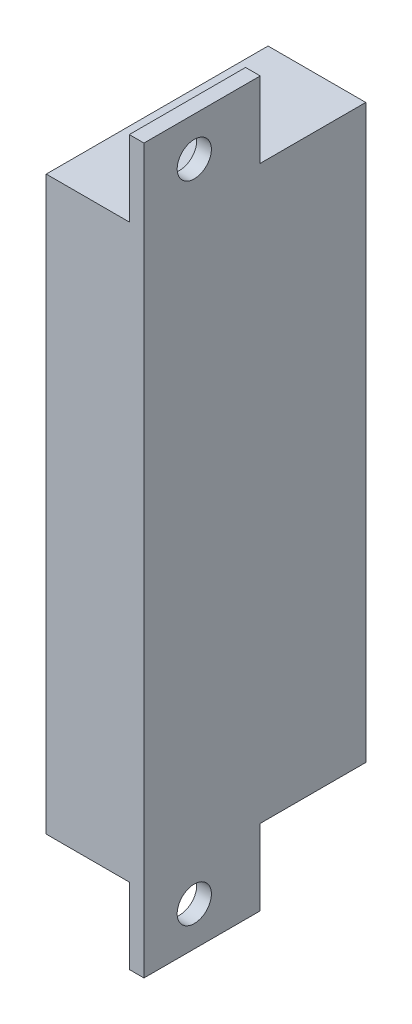
ISO-10303-21;
HEADER;
FILE_DESCRIPTION(('STEP AP214'),'2;1');
FILE_NAME('part.step','',(''),(''),'','','');
FILE_SCHEMA(('AUTOMOTIVE_DESIGN { 1 0 10303 214 1 1 1 1 }'));
ENDSEC;
DATA;
#1=APPLICATION_CONTEXT('core data for automotive mechanical design processes');
#2=APPLICATION_PROTOCOL_DEFINITION('international standard','automotive_design',2000,#1);
#3=PRODUCT_CONTEXT('',#1,'mechanical');
#4=PRODUCT('Part','Part','',(#3));
#5=PRODUCT_RELATED_PRODUCT_CATEGORY('part','',(#4));
#6=PRODUCT_DEFINITION_FORMATION('','',#4);
#7=PRODUCT_DEFINITION_CONTEXT('part definition',#1,'design');
#8=PRODUCT_DEFINITION('design','',#6,#7);
#9=PRODUCT_DEFINITION_SHAPE('','',#8);
#10=(LENGTH_UNIT() NAMED_UNIT(*) SI_UNIT(.MILLI.,.METRE.));
#11=(NAMED_UNIT(*) PLANE_ANGLE_UNIT() SI_UNIT($,.RADIAN.));
#12=(NAMED_UNIT(*) SI_UNIT($,.STERADIAN.) SOLID_ANGLE_UNIT());
#13=UNCERTAINTY_MEASURE_WITH_UNIT(LENGTH_MEASURE(1.E-05),#10,'distance_accuracy_value','');
#14=(GEOMETRIC_REPRESENTATION_CONTEXT(3) GLOBAL_UNCERTAINTY_ASSIGNED_CONTEXT((#13)) GLOBAL_UNIT_ASSIGNED_CONTEXT((#10,
#11,#12)) REPRESENTATION_CONTEXT('',''));
#15=CARTESIAN_POINT('',(0.,0.,0.));
#16=DIRECTION('',(0.,0.,1.));
#17=DIRECTION('',(1.,0.,0.));
#18=AXIS2_PLACEMENT_3D('',#15,#16,#17);
#19=CARTESIAN_POINT('',(145.,-102.25,46.35));
#20=DIRECTION('',(1.,0.,0.));
#21=DIRECTION('',(0.,0.,-1.));
#22=AXIS2_PLACEMENT_3D('',#19,#20,#21);
#23=PLANE('',#22);
#24=DIRECTION('',(0.,-1.,0.));
#25=VECTOR('',#24,1.);
#26=CARTESIAN_POINT('',(145.,-102.25,23.65));
#27=LINE('',#26,#25);
#28=CARTESIAN_POINT('',(145.,-43.75,23.65));
#29=VERTEX_POINT('',#28);
#30=CARTESIAN_POINT('',(145.,-102.25,23.65));
#31=VERTEX_POINT('',#30);
#32=EDGE_CURVE('E146',#29,#31,#27,.T.);
#33=ORIENTED_EDGE('',*,*,#32,.T.);
#34=DIRECTION('',(0.,0.,-1.));
#35=VECTOR('',#34,1.);
#36=CARTESIAN_POINT('',(145.,-102.25,46.35));
#37=LINE('',#36,#35);
#38=CARTESIAN_POINT('',(145.,-102.25,46.35));
#39=VERTEX_POINT('',#38);
#40=EDGE_CURVE('E11',#39,#31,#37,.T.);
#41=ORIENTED_EDGE('',*,*,#40,.F.);
#42=DIRECTION('',(0.,-1.,0.));
#43=VECTOR('',#42,1.);
#44=CARTESIAN_POINT('',(145.,-102.25,46.35));
#45=LINE('',#44,#43);
#46=CARTESIAN_POINT('',(145.,-43.75,46.35));
#47=VERTEX_POINT('',#46);
#48=EDGE_CURVE('E159',#47,#39,#45,.T.);
#49=ORIENTED_EDGE('',*,*,#48,.F.);
#50=DIRECTION('',(0.,0.,-1.));
#51=VECTOR('',#50,1.);
#52=CARTESIAN_POINT('',(145.,-43.75,46.35));
#53=LINE('',#52,#51);
#54=EDGE_CURVE('E138',#47,#29,#53,.T.);
#55=ORIENTED_EDGE('',*,*,#54,.T.);
#56=EDGE_LOOP('',(#33,#41,#49,#55));
#57=FACE_BOUND('',#56,.T.);
#58=ADVANCED_FACE('F41',(#57),#23,.F.);
#59=CARTESIAN_POINT('',(145.,-102.25,46.35));
#60=DIRECTION('',(0.,1.,0.));
#61=DIRECTION('',(0.,0.,1.));
#62=AXIS2_PLACEMENT_3D('',#59,#60,#61);
#63=PLANE('',#62);
#64=DIRECTION('',(0.,0.,-1.));
#65=VECTOR('',#64,1.);
#66=CARTESIAN_POINT('',(155.,-102.25,46.35));
#67=LINE('',#66,#65);
#68=CARTESIAN_POINT('',(155.,-102.25,34.45));
#69=VERTEX_POINT('',#68);
#70=CARTESIAN_POINT('',(155.,-102.25,23.65));
#71=VERTEX_POINT('',#70);
#72=EDGE_CURVE('E48',#69,#71,#67,.T.);
#73=ORIENTED_EDGE('',*,*,#72,.F.);
#74=DIRECTION('',(-1.,0.,0.));
#75=VECTOR('',#74,1.);
#76=CARTESIAN_POINT('',(153.5,-102.25,34.45));
#77=LINE('',#76,#75);
#78=CARTESIAN_POINT('',(153.5,-102.25,34.45));
#79=VERTEX_POINT('',#78);
#80=EDGE_CURVE('E187',#69,#79,#77,.T.);
#81=ORIENTED_EDGE('',*,*,#80,.T.);
#82=DIRECTION('',(0.,0.,-1.));
#83=VECTOR('',#82,1.);
#84=CARTESIAN_POINT('',(153.5,-102.25,46.35));
#85=LINE('',#84,#83);
#86=CARTESIAN_POINT('',(153.5,-102.25,46.35));
#87=VERTEX_POINT('',#86);
#88=EDGE_CURVE('E65',#87,#79,#85,.T.);
#89=ORIENTED_EDGE('',*,*,#88,.F.);
#90=DIRECTION('',(1.,0.,0.));
#91=VECTOR('',#90,1.);
#92=CARTESIAN_POINT('',(145.,-102.25,46.35));
#93=LINE('',#92,#91);
#94=EDGE_CURVE('E143',#39,#87,#93,.T.);
#95=ORIENTED_EDGE('',*,*,#94,.F.);
#96=ORIENTED_EDGE('',*,*,#40,.T.);
#97=DIRECTION('',(1.,0.,0.));
#98=VECTOR('',#97,1.);
#99=CARTESIAN_POINT('',(145.,-102.25,23.65));
#100=LINE('',#99,#98);
#101=EDGE_CURVE('E155',#31,#71,#100,.T.);
#102=ORIENTED_EDGE('',*,*,#101,.T.);
#103=EDGE_LOOP('',(#73,#81,#89,#95,#96,#102));
#104=FACE_BOUND('',#103,.T.);
#105=ADVANCED_FACE('F175',(#104),#63,.F.);
#106=CARTESIAN_POINT('',(155.,-102.25,46.35));
#107=DIRECTION('',(-1.,0.,0.));
#108=DIRECTION('',(0.,0.,1.));
#109=AXIS2_PLACEMENT_3D('',#106,#107,#108);
#110=PLANE('',#109);
#111=CARTESIAN_POINT('',(155.,-106.,41.2));
#112=DIRECTION('',(1.,0.,0.));
#113=DIRECTION('',(0.,0.,-1.));
#114=AXIS2_PLACEMENT_3D('',#111,#112,#113);
#115=CIRCLE('',#114,1.75);
#116=CARTESIAN_POINT('',(155.,-106.,39.45));
#117=VERTEX_POINT('',#116);
#118=EDGE_CURVE('E216',#117,#117,#115,.T.);
#119=ORIENTED_EDGE('',*,*,#118,.F.);
#120=EDGE_LOOP('',(#119));
#121=FACE_BOUND('',#120,.T.);
#122=CARTESIAN_POINT('',(155.,-40.,41.2));
#123=DIRECTION('',(1.,0.,0.));
#124=DIRECTION('',(0.,0.,-1.));
#125=AXIS2_PLACEMENT_3D('',#122,#123,#124);
#126=CIRCLE('',#125,1.75);
#127=CARTESIAN_POINT('',(155.,-40.,39.45));
#128=VERTEX_POINT('',#127);
#129=EDGE_CURVE('E215',#128,#128,#126,.T.);
#130=ORIENTED_EDGE('',*,*,#129,.F.);
#131=EDGE_LOOP('',(#130));
#132=FACE_BOUND('',#131,.T.);
#133=DIRECTION('',(0.,1.,0.));
#134=VECTOR('',#133,1.);
#135=CARTESIAN_POINT('',(155.,-102.25,23.65));
#136=LINE('',#135,#134);
#137=CARTESIAN_POINT('',(155.,-43.75,23.65));
#138=VERTEX_POINT('',#137);
#139=EDGE_CURVE('E156',#71,#138,#136,.T.);
#140=ORIENTED_EDGE('',*,*,#139,.T.);
#141=DIRECTION('',(0.,0.,-1.));
#142=VECTOR('',#141,1.);
#143=CARTESIAN_POINT('',(155.,-43.75,46.35));
#144=LINE('',#143,#142);
#145=CARTESIAN_POINT('',(155.,-43.75,34.45));
#146=VERTEX_POINT('',#145);
#147=EDGE_CURVE('E141',#146,#138,#144,.T.);
#148=ORIENTED_EDGE('',*,*,#147,.F.);
#149=DIRECTION('',(0.,1.,0.));
#150=VECTOR('',#149,1.);
#151=CARTESIAN_POINT('',(155.,-43.75,34.45));
#152=LINE('',#151,#150);
#153=CARTESIAN_POINT('',(155.,-36.,34.45));
#154=VERTEX_POINT('',#153);
#155=EDGE_CURVE('E202',#146,#154,#152,.T.);
#156=ORIENTED_EDGE('',*,*,#155,.T.);
#157=DIRECTION('',(0.,0.,-1.));
#158=VECTOR('',#157,1.);
#159=CARTESIAN_POINT('',(155.,-36.,46.35));
#160=LINE('',#159,#158);
#161=CARTESIAN_POINT('',(155.,-36.,46.35));
#162=VERTEX_POINT('',#161);
#163=EDGE_CURVE('E134',#162,#154,#160,.T.);
#164=ORIENTED_EDGE('',*,*,#163,.F.);
#165=DIRECTION('',(0.,1.,0.));
#166=VECTOR('',#165,1.);
#167=CARTESIAN_POINT('',(155.,-102.25,46.35));
#168=LINE('',#167,#166);
#169=CARTESIAN_POINT('',(155.,-110.,46.35));
#170=VERTEX_POINT('',#169);
#171=EDGE_CURVE('E142',#170,#162,#168,.T.);
#172=ORIENTED_EDGE('',*,*,#171,.F.);
#173=DIRECTION('',(0.,0.,-1.));
#174=VECTOR('',#173,1.);
#175=CARTESIAN_POINT('',(155.,-110.,46.35));
#176=LINE('',#175,#174);
#177=CARTESIAN_POINT('',(155.,-110.,34.45));
#178=VERTEX_POINT('',#177);
#179=EDGE_CURVE('E185',#170,#178,#176,.T.);
#180=ORIENTED_EDGE('',*,*,#179,.T.);
#181=DIRECTION('',(0.,1.,0.));
#182=VECTOR('',#181,1.);
#183=CARTESIAN_POINT('',(155.,-110.,34.45));
#184=LINE('',#183,#182);
#185=EDGE_CURVE('E167',#178,#69,#184,.T.);
#186=ORIENTED_EDGE('',*,*,#185,.T.);
#187=ORIENTED_EDGE('',*,*,#72,.T.);
#188=EDGE_LOOP('',(#140,#148,#156,#164,#172,#180,#186,#187));
#189=FACE_BOUND('',#188,.T.);
#190=ADVANCED_FACE('F165',(#121,#132,#189),#110,.F.);
#191=CARTESIAN_POINT('',(145.,-43.75,46.35));
#192=DIRECTION('',(0.,-1.,0.));
#193=DIRECTION('',(0.,0.,-1.));
#194=AXIS2_PLACEMENT_3D('',#191,#192,#193);
#195=PLANE('',#194);
#196=DIRECTION('',(0.,0.,-1.));
#197=VECTOR('',#196,1.);
#198=CARTESIAN_POINT('',(153.5,-43.75,46.35));
#199=LINE('',#198,#197);
#200=CARTESIAN_POINT('',(153.5,-43.75,46.35));
#201=VERTEX_POINT('',#200);
#202=CARTESIAN_POINT('',(153.5,-43.75,34.45));
#203=VERTEX_POINT('',#202);
#204=EDGE_CURVE('E128',#201,#203,#199,.T.);
#205=ORIENTED_EDGE('',*,*,#204,.T.);
#206=DIRECTION('',(1.,0.,0.));
#207=VECTOR('',#206,1.);
#208=CARTESIAN_POINT('',(153.5,-43.75,34.45));
#209=LINE('',#208,#207);
#210=EDGE_CURVE('E204',#203,#146,#209,.T.);
#211=ORIENTED_EDGE('',*,*,#210,.T.);
#212=ORIENTED_EDGE('',*,*,#147,.T.);
#213=DIRECTION('',(-1.,0.,0.));
#214=VECTOR('',#213,1.);
#215=CARTESIAN_POINT('',(145.,-43.75,23.65));
#216=LINE('',#215,#214);
#217=EDGE_CURVE('E158',#138,#29,#216,.T.);
#218=ORIENTED_EDGE('',*,*,#217,.T.);
#219=ORIENTED_EDGE('',*,*,#54,.F.);
#220=DIRECTION('',(-1.,0.,0.));
#221=VECTOR('',#220,1.);
#222=CARTESIAN_POINT('',(145.,-43.75,46.35));
#223=LINE('',#222,#221);
#224=EDGE_CURVE('E125',#201,#47,#223,.T.);
#225=ORIENTED_EDGE('',*,*,#224,.F.);
#226=EDGE_LOOP('',(#205,#211,#212,#218,#219,#225));
#227=FACE_BOUND('',#226,.T.);
#228=ADVANCED_FACE('F140',(#227),#195,.F.);
#229=CARTESIAN_POINT('',(0.,0.,46.35));
#230=DIRECTION('',(0.,0.,-1.));
#231=DIRECTION('',(-1.,0.,0.));
#232=AXIS2_PLACEMENT_3D('',#229,#230,#231);
#233=PLANE('',#232);
#234=ORIENTED_EDGE('',*,*,#48,.T.);
#235=ORIENTED_EDGE('',*,*,#94,.T.);
#236=DIRECTION('',(0.,-1.,0.));
#237=VECTOR('',#236,1.);
#238=CARTESIAN_POINT('',(153.5,-110.,46.35));
#239=LINE('',#238,#237);
#240=CARTESIAN_POINT('',(153.5,-110.,46.35));
#241=VERTEX_POINT('',#240);
#242=EDGE_CURVE('E189',#87,#241,#239,.T.);
#243=ORIENTED_EDGE('',*,*,#242,.T.);
#244=DIRECTION('',(1.,0.,0.));
#245=VECTOR('',#244,1.);
#246=CARTESIAN_POINT('',(153.5,-110.,46.35));
#247=LINE('',#246,#245);
#248=EDGE_CURVE('E184',#241,#170,#247,.T.);
#249=ORIENTED_EDGE('',*,*,#248,.T.);
#250=ORIENTED_EDGE('',*,*,#171,.T.);
#251=DIRECTION('',(-1.,0.,0.));
#252=VECTOR('',#251,1.);
#253=CARTESIAN_POINT('',(153.5,-36.,46.35));
#254=LINE('',#253,#252);
#255=CARTESIAN_POINT('',(153.5,-36.,46.35));
#256=VERTEX_POINT('',#255);
#257=EDGE_CURVE('E123',#162,#256,#254,.T.);
#258=ORIENTED_EDGE('',*,*,#257,.T.);
#259=DIRECTION('',(0.,-1.,0.));
#260=VECTOR('',#259,1.);
#261=CARTESIAN_POINT('',(153.5,-43.75,46.35));
#262=LINE('',#261,#260);
#263=EDGE_CURVE('E117',#256,#201,#262,.T.);
#264=ORIENTED_EDGE('',*,*,#263,.T.);
#265=ORIENTED_EDGE('',*,*,#224,.T.);
#266=EDGE_LOOP('',(#234,#235,#243,#249,#250,#258,#264,#265));
#267=FACE_BOUND('',#266,.T.);
#268=ADVANCED_FACE('F119',(#267),#233,.F.);
#269=CARTESIAN_POINT('',(0.,0.,23.65));
#270=DIRECTION('',(0.,0.,-1.));
#271=DIRECTION('',(-1.,0.,0.));
#272=AXIS2_PLACEMENT_3D('',#269,#270,#271);
#273=PLANE('',#272);
#274=ORIENTED_EDGE('',*,*,#32,.F.);
#275=ORIENTED_EDGE('',*,*,#217,.F.);
#276=ORIENTED_EDGE('',*,*,#139,.F.);
#277=ORIENTED_EDGE('',*,*,#101,.F.);
#278=EDGE_LOOP('',(#274,#275,#276,#277));
#279=FACE_BOUND('',#278,.T.);
#280=ADVANCED_FACE('F176',(#279),#273,.T.);
#281=CARTESIAN_POINT('',(153.5,-110.,46.35));
#282=DIRECTION('',(1.,0.,0.));
#283=DIRECTION('',(0.,0.,-1.));
#284=AXIS2_PLACEMENT_3D('',#281,#282,#283);
#285=PLANE('',#284);
#286=CARTESIAN_POINT('',(153.5,-106.,41.2));
#287=DIRECTION('',(1.,0.,0.));
#288=DIRECTION('',(0.,0.,-1.));
#289=AXIS2_PLACEMENT_3D('',#286,#287,#288);
#290=CIRCLE('',#289,1.75);
#291=CARTESIAN_POINT('',(153.5,-106.,39.45));
#292=VERTEX_POINT('',#291);
#293=EDGE_CURVE('E206',#292,#292,#290,.T.);
#294=ORIENTED_EDGE('',*,*,#293,.T.);
#295=EDGE_LOOP('',(#294));
#296=FACE_BOUND('',#295,.T.);
#297=DIRECTION('',(0.,-1.,0.));
#298=VECTOR('',#297,1.);
#299=CARTESIAN_POINT('',(153.5,-110.,34.45));
#300=LINE('',#299,#298);
#301=CARTESIAN_POINT('',(153.5,-110.,34.45));
#302=VERTEX_POINT('',#301);
#303=EDGE_CURVE('E133',#79,#302,#300,.T.);
#304=ORIENTED_EDGE('',*,*,#303,.T.);
#305=DIRECTION('',(0.,0.,-1.));
#306=VECTOR('',#305,1.);
#307=CARTESIAN_POINT('',(153.5,-110.,46.35));
#308=LINE('',#307,#306);
#309=EDGE_CURVE('E152',#241,#302,#308,.T.);
#310=ORIENTED_EDGE('',*,*,#309,.F.);
#311=ORIENTED_EDGE('',*,*,#242,.F.);
#312=ORIENTED_EDGE('',*,*,#88,.T.);
#313=EDGE_LOOP('',(#304,#310,#311,#312));
#314=FACE_BOUND('',#313,.T.);
#315=ADVANCED_FACE('F225',(#296,#314),#285,.F.);
#316=CARTESIAN_POINT('',(153.5,-110.,46.35));
#317=DIRECTION('',(0.,1.,0.));
#318=DIRECTION('',(0.,0.,1.));
#319=AXIS2_PLACEMENT_3D('',#316,#317,#318);
#320=PLANE('',#319);
#321=DIRECTION('',(1.,0.,0.));
#322=VECTOR('',#321,1.);
#323=CARTESIAN_POINT('',(153.5,-110.,34.45));
#324=LINE('',#323,#322);
#325=EDGE_CURVE('E188',#302,#178,#324,.T.);
#326=ORIENTED_EDGE('',*,*,#325,.T.);
#327=ORIENTED_EDGE('',*,*,#179,.F.);
#328=ORIENTED_EDGE('',*,*,#248,.F.);
#329=ORIENTED_EDGE('',*,*,#309,.T.);
#330=EDGE_LOOP('',(#326,#327,#328,#329));
#331=FACE_BOUND('',#330,.T.);
#332=ADVANCED_FACE('F264',(#331),#320,.F.);
#333=CARTESIAN_POINT('',(0.,0.,34.45));
#334=DIRECTION('',(0.,0.,-1.));
#335=DIRECTION('',(-1.,0.,0.));
#336=AXIS2_PLACEMENT_3D('',#333,#334,#335);
#337=PLANE('',#336);
#338=ORIENTED_EDGE('',*,*,#303,.F.);
#339=ORIENTED_EDGE('',*,*,#80,.F.);
#340=ORIENTED_EDGE('',*,*,#185,.F.);
#341=ORIENTED_EDGE('',*,*,#325,.F.);
#342=EDGE_LOOP('',(#338,#339,#340,#341));
#343=FACE_BOUND('',#342,.T.);
#344=ADVANCED_FACE('F270',(#343),#337,.T.);
#345=CARTESIAN_POINT('',(153.5,-43.75,46.35));
#346=DIRECTION('',(1.,0.,0.));
#347=DIRECTION('',(0.,0.,-1.));
#348=AXIS2_PLACEMENT_3D('',#345,#346,#347);
#349=PLANE('',#348);
#350=CARTESIAN_POINT('',(153.5,-40.,41.2));
#351=DIRECTION('',(1.,0.,0.));
#352=DIRECTION('',(0.,0.,-1.));
#353=AXIS2_PLACEMENT_3D('',#350,#351,#352);
#354=CIRCLE('',#353,1.75);
#355=CARTESIAN_POINT('',(153.5,-40.,39.45));
#356=VERTEX_POINT('',#355);
#357=EDGE_CURVE('E208',#356,#356,#354,.T.);
#358=ORIENTED_EDGE('',*,*,#357,.T.);
#359=EDGE_LOOP('',(#358));
#360=FACE_BOUND('',#359,.T.);
#361=DIRECTION('',(0.,-1.,0.));
#362=VECTOR('',#361,1.);
#363=CARTESIAN_POINT('',(153.5,-43.75,34.45));
#364=LINE('',#363,#362);
#365=CARTESIAN_POINT('',(153.5,-36.,34.45));
#366=VERTEX_POINT('',#365);
#367=EDGE_CURVE('E54',#366,#203,#364,.T.);
#368=ORIENTED_EDGE('',*,*,#367,.T.);
#369=ORIENTED_EDGE('',*,*,#204,.F.);
#370=ORIENTED_EDGE('',*,*,#263,.F.);
#371=DIRECTION('',(0.,0.,-1.));
#372=VECTOR('',#371,1.);
#373=CARTESIAN_POINT('',(153.5,-36.,46.35));
#374=LINE('',#373,#372);
#375=EDGE_CURVE('E199',#256,#366,#374,.T.);
#376=ORIENTED_EDGE('',*,*,#375,.T.);
#377=EDGE_LOOP('',(#368,#369,#370,#376));
#378=FACE_BOUND('',#377,.T.);
#379=ADVANCED_FACE('F131',(#360,#378),#349,.F.);
#380=CARTESIAN_POINT('',(153.5,-36.,46.35));
#381=DIRECTION('',(0.,-1.,0.));
#382=DIRECTION('',(0.,0.,-1.));
#383=AXIS2_PLACEMENT_3D('',#380,#381,#382);
#384=PLANE('',#383);
#385=DIRECTION('',(-1.,0.,0.));
#386=VECTOR('',#385,1.);
#387=CARTESIAN_POINT('',(153.5,-36.,34.45));
#388=LINE('',#387,#386);
#389=EDGE_CURVE('E129',#154,#366,#388,.T.);
#390=ORIENTED_EDGE('',*,*,#389,.T.);
#391=ORIENTED_EDGE('',*,*,#375,.F.);
#392=ORIENTED_EDGE('',*,*,#257,.F.);
#393=ORIENTED_EDGE('',*,*,#163,.T.);
#394=EDGE_LOOP('',(#390,#391,#392,#393));
#395=FACE_BOUND('',#394,.T.);
#396=ADVANCED_FACE('F244',(#395),#384,.F.);
#397=CARTESIAN_POINT('',(0.,0.,34.45));
#398=DIRECTION('',(0.,0.,-1.));
#399=DIRECTION('',(-1.,0.,0.));
#400=AXIS2_PLACEMENT_3D('',#397,#398,#399);
#401=PLANE('',#400);
#402=ORIENTED_EDGE('',*,*,#367,.F.);
#403=ORIENTED_EDGE('',*,*,#389,.F.);
#404=ORIENTED_EDGE('',*,*,#155,.F.);
#405=ORIENTED_EDGE('',*,*,#210,.F.);
#406=EDGE_LOOP('',(#402,#403,#404,#405));
#407=FACE_BOUND('',#406,.T.);
#408=ADVANCED_FACE('F238',(#407),#401,.T.);
#409=CARTESIAN_POINT('',(153.5,-40.,41.2));
#410=DIRECTION('',(1.,0.,0.));
#411=DIRECTION('',(0.,0.,-1.));
#412=AXIS2_PLACEMENT_3D('',#409,#410,#411);
#413=CYLINDRICAL_SURFACE('',#412,1.75);
#414=ORIENTED_EDGE('',*,*,#357,.F.);
#415=EDGE_LOOP('',(#414));
#416=FACE_BOUND('',#415,.T.);
#417=ORIENTED_EDGE('',*,*,#129,.T.);
#418=EDGE_LOOP('',(#417));
#419=FACE_BOUND('',#418,.T.);
#420=ADVANCED_FACE('F226',(#416,#419),#413,.F.);
#421=CARTESIAN_POINT('',(153.5,-106.,41.2));
#422=DIRECTION('',(1.,0.,0.));
#423=DIRECTION('',(0.,0.,-1.));
#424=AXIS2_PLACEMENT_3D('',#421,#422,#423);
#425=CYLINDRICAL_SURFACE('',#424,1.75);
#426=ORIENTED_EDGE('',*,*,#293,.F.);
#427=EDGE_LOOP('',(#426));
#428=FACE_BOUND('',#427,.T.);
#429=ORIENTED_EDGE('',*,*,#118,.T.);
#430=EDGE_LOOP('',(#429));
#431=FACE_BOUND('',#430,.T.);
#432=ADVANCED_FACE('F224',(#428,#431),#425,.F.);
#433=CLOSED_SHELL('',(#58,#105,#190,#228,#268,#280,#315,#332,#344,#379,#396,#408,#420,#432));
#434=MANIFOLD_SOLID_BREP('B2',#433);
#435=ADVANCED_BREP_SHAPE_REPRESENTATION('',(#18,#434),#14);
#436=SHAPE_DEFINITION_REPRESENTATION(#9,#435);
ENDSEC;
END-ISO-10303-21;
